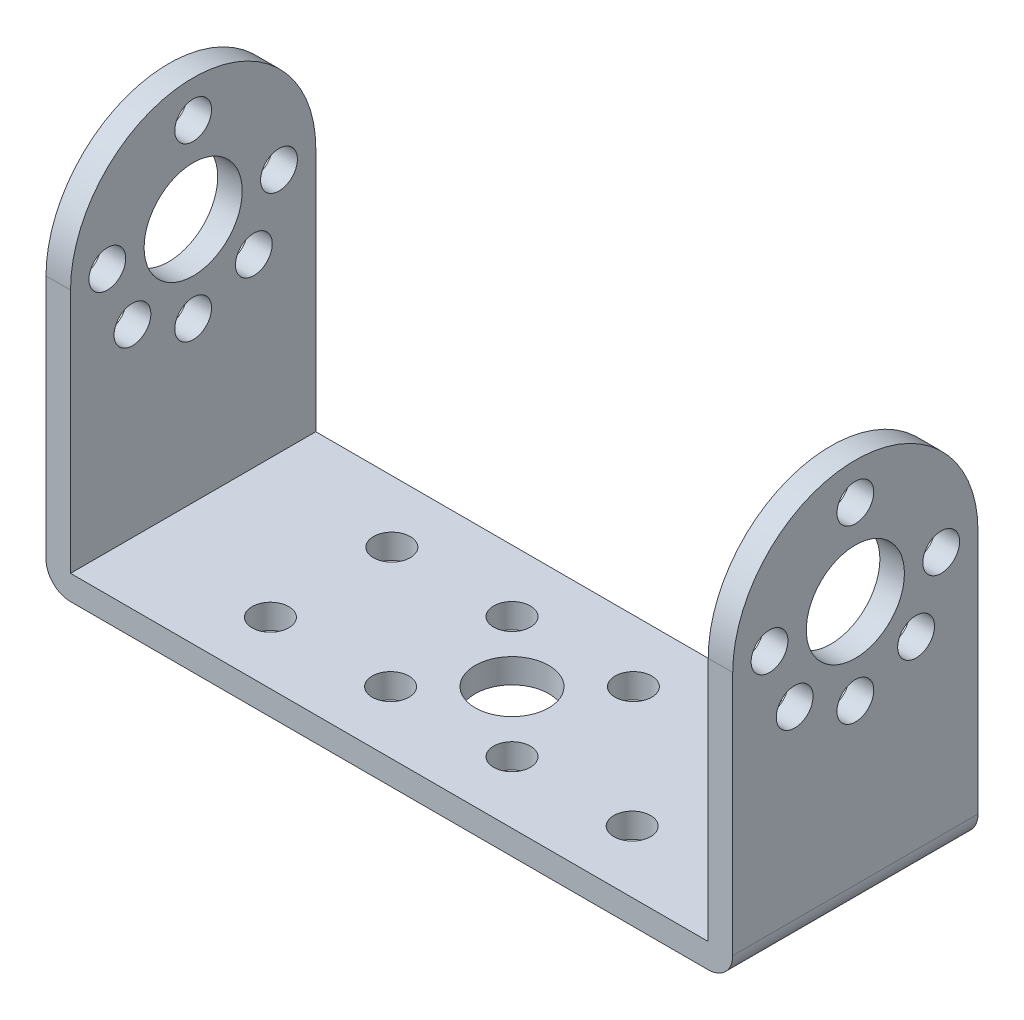
ISO-10303-21;
HEADER;
FILE_DESCRIPTION(('STEP AP214'),'2;1');
FILE_NAME('part.step','',(''),(''),'','','');
FILE_SCHEMA(('AUTOMOTIVE_DESIGN { 1 0 10303 214 1 1 1 1 }'));
ENDSEC;
DATA;
#1=APPLICATION_CONTEXT('core data for automotive mechanical design processes');
#2=APPLICATION_PROTOCOL_DEFINITION('international standard','automotive_design',2000,#1);
#3=PRODUCT_CONTEXT('',#1,'mechanical');
#4=PRODUCT('Part','Part','',(#3));
#5=PRODUCT_RELATED_PRODUCT_CATEGORY('part','',(#4));
#6=PRODUCT_DEFINITION_FORMATION('','',#4);
#7=PRODUCT_DEFINITION_CONTEXT('part definition',#1,'design');
#8=PRODUCT_DEFINITION('design','',#6,#7);
#9=PRODUCT_DEFINITION_SHAPE('','',#8);
#10=(LENGTH_UNIT() NAMED_UNIT(*) SI_UNIT(.MILLI.,.METRE.));
#11=(NAMED_UNIT(*) PLANE_ANGLE_UNIT() SI_UNIT($,.RADIAN.));
#12=(NAMED_UNIT(*) SI_UNIT($,.STERADIAN.) SOLID_ANGLE_UNIT());
#13=UNCERTAINTY_MEASURE_WITH_UNIT(LENGTH_MEASURE(1.E-05),#10,'distance_accuracy_value','');
#14=(GEOMETRIC_REPRESENTATION_CONTEXT(3) GLOBAL_UNCERTAINTY_ASSIGNED_CONTEXT((#13)) GLOBAL_UNIT_ASSIGNED_CONTEXT((#10,
#11,#12)) REPRESENTATION_CONTEXT('',''));
#15=CARTESIAN_POINT('',(0.,0.,0.));
#16=DIRECTION('',(0.,0.,1.));
#17=DIRECTION('',(1.,0.,0.));
#18=AXIS2_PLACEMENT_3D('',#15,#16,#17);
#19=CARTESIAN_POINT('',(26.,32.,-9.99999999999999));
#20=DIRECTION('',(1.,0.,0.));
#21=DIRECTION('',(0.,0.,-1.));
#22=AXIS2_PLACEMENT_3D('',#19,#20,#21);
#23=PLANE('',#22);
#24=CARTESIAN_POINT('',(26.,17.0502525316941,-4.94974746830577));
#25=DIRECTION('',(1.,0.,0.));
#26=DIRECTION('',(0.,0.,-1.));
#27=AXIS2_PLACEMENT_3D('',#24,#25,#26);
#28=CIRCLE('',#27,1.5);
#29=CARTESIAN_POINT('',(26.,17.0502525316941,-6.44974746830577));
#30=VERTEX_POINT('',#29);
#31=EDGE_CURVE('E422',#30,#30,#28,.T.);
#32=ORIENTED_EDGE('',*,*,#31,.T.);
#33=EDGE_LOOP('',(#32));
#34=FACE_BOUND('',#33,.T.);
#35=CARTESIAN_POINT('',(26.,17.0502525316942,4.94974746830584));
#36=DIRECTION('',(1.,0.,0.));
#37=DIRECTION('',(0.,0.,-1.));
#38=AXIS2_PLACEMENT_3D('',#35,#36,#37);
#39=CIRCLE('',#38,1.5);
#40=CARTESIAN_POINT('',(26.,17.0502525316942,3.44974746830584));
#41=VERTEX_POINT('',#40);
#42=EDGE_CURVE('E465',#41,#41,#39,.T.);
#43=ORIENTED_EDGE('',*,*,#42,.T.);
#44=EDGE_LOOP('',(#43));
#45=FACE_BOUND('',#44,.T.);
#46=CARTESIAN_POINT('',(26.,21.9999999999999,-7.));
#47=DIRECTION('',(1.,0.,0.));
#48=DIRECTION('',(0.,0.,-1.));
#49=AXIS2_PLACEMENT_3D('',#46,#47,#48);
#50=CIRCLE('',#49,1.5);
#51=CARTESIAN_POINT('',(26.,21.9999999999999,-8.5));
#52=VERTEX_POINT('',#51);
#53=EDGE_CURVE('E459',#52,#52,#50,.T.);
#54=ORIENTED_EDGE('',*,*,#53,.T.);
#55=EDGE_LOOP('',(#54));
#56=FACE_BOUND('',#55,.T.);
#57=CARTESIAN_POINT('',(26.,22.,7.));
#58=DIRECTION('',(1.,0.,0.));
#59=DIRECTION('',(0.,0.,-1.));
#60=AXIS2_PLACEMENT_3D('',#57,#58,#59);
#61=CIRCLE('',#60,1.5);
#62=CARTESIAN_POINT('',(26.,22.,5.5));
#63=VERTEX_POINT('',#62);
#64=EDGE_CURVE('E453',#63,#63,#61,.T.);
#65=ORIENTED_EDGE('',*,*,#64,.T.);
#66=EDGE_LOOP('',(#65));
#67=FACE_BOUND('',#66,.T.);
#68=CARTESIAN_POINT('',(26.,22.,0.));
#69=DIRECTION('',(1.,0.,0.));
#70=DIRECTION('',(0.,0.,-1.));
#71=AXIS2_PLACEMENT_3D('',#68,#69,#70);
#72=CIRCLE('',#71,4.);
#73=CARTESIAN_POINT('',(26.,22.,-4.));
#74=VERTEX_POINT('',#73);
#75=EDGE_CURVE('E447',#74,#74,#72,.T.);
#76=ORIENTED_EDGE('',*,*,#75,.T.);
#77=EDGE_LOOP('',(#76));
#78=FACE_BOUND('',#77,.T.);
#79=CARTESIAN_POINT('',(26.,29.,0.));
#80=DIRECTION('',(1.,0.,0.));
#81=DIRECTION('',(0.,0.,-1.));
#82=AXIS2_PLACEMENT_3D('',#79,#80,#81);
#83=CIRCLE('',#82,1.5);
#84=CARTESIAN_POINT('',(26.,29.,-1.50000000000005));
#85=VERTEX_POINT('',#84);
#86=EDGE_CURVE('E435',#85,#85,#83,.T.);
#87=ORIENTED_EDGE('',*,*,#86,.T.);
#88=EDGE_LOOP('',(#87));
#89=FACE_BOUND('',#88,.T.);
#90=CARTESIAN_POINT('',(26.,15.,0.));
#91=DIRECTION('',(1.,0.,0.));
#92=DIRECTION('',(0.,0.,-1.));
#93=AXIS2_PLACEMENT_3D('',#90,#91,#92);
#94=CIRCLE('',#93,1.5);
#95=CARTESIAN_POINT('',(26.,15.,-1.5));
#96=VERTEX_POINT('',#95);
#97=EDGE_CURVE('E441',#96,#96,#94,.T.);
#98=ORIENTED_EDGE('',*,*,#97,.T.);
#99=EDGE_LOOP('',(#98));
#100=FACE_BOUND('',#99,.T.);
#101=DIRECTION('',(0.,-1.,0.));
#102=VECTOR('',#101,1.);
#103=CARTESIAN_POINT('',(26.,32.,9.99999999999999));
#104=LINE('',#103,#102);
#105=CARTESIAN_POINT('',(26.,22.,10.));
#106=VERTEX_POINT('',#105);
#107=CARTESIAN_POINT('',(26.,2.,9.99999999999999));
#108=VERTEX_POINT('',#107);
#109=EDGE_CURVE('E325',#106,#108,#104,.T.);
#110=ORIENTED_EDGE('',*,*,#109,.F.);
#111=CARTESIAN_POINT('',(26.,22.,0.));
#112=DIRECTION('',(1.,0.,0.));
#113=DIRECTION('',(0.,0.,-1.));
#114=AXIS2_PLACEMENT_3D('',#111,#112,#113);
#115=CIRCLE('',#114,10.);
#116=CARTESIAN_POINT('',(26.,22.,-10.));
#117=VERTEX_POINT('',#116);
#118=EDGE_CURVE('E312',#117,#106,#115,.T.);
#119=ORIENTED_EDGE('',*,*,#118,.F.);
#120=DIRECTION('',(0.,-1.,0.));
#121=VECTOR('',#120,1.);
#122=CARTESIAN_POINT('',(26.,32.,-9.99999999999999));
#123=LINE('',#122,#121);
#124=CARTESIAN_POINT('',(26.,2.,-9.99999999999999));
#125=VERTEX_POINT('',#124);
#126=EDGE_CURVE('E317',#117,#125,#123,.T.);
#127=ORIENTED_EDGE('',*,*,#126,.T.);
#128=DIRECTION('',(0.,0.,-1.));
#129=VECTOR('',#128,1.);
#130=CARTESIAN_POINT('',(26.,2.,-9.99999999999999));
#131=LINE('',#130,#129);
#132=EDGE_CURVE('E382',#108,#125,#131,.T.);
#133=ORIENTED_EDGE('',*,*,#132,.F.);
#134=EDGE_LOOP('',(#110,#119,#127,#133));
#135=FACE_BOUND('',#134,.T.);
#136=ADVANCED_FACE('F202',(#34,#45,#56,#67,#78,#89,#100,#135),#23,.F.);
#137=CARTESIAN_POINT('',(28.,32.,-9.99999999999999));
#138=DIRECTION('',(-1.,0.,0.));
#139=DIRECTION('',(0.,0.,1.));
#140=AXIS2_PLACEMENT_3D('',#137,#138,#139);
#141=PLANE('',#140);
#142=CARTESIAN_POINT('',(28.,17.0502525316941,-4.94974746830577));
#143=DIRECTION('',(1.,0.,0.));
#144=DIRECTION('',(0.,0.,-1.));
#145=AXIS2_PLACEMENT_3D('',#142,#143,#144);
#146=CIRCLE('',#145,1.5);
#147=CARTESIAN_POINT('',(28.,17.0502525316941,-6.44974746830577));
#148=VERTEX_POINT('',#147);
#149=EDGE_CURVE('E660',#148,#148,#146,.T.);
#150=ORIENTED_EDGE('',*,*,#149,.F.);
#151=EDGE_LOOP('',(#150));
#152=FACE_BOUND('',#151,.T.);
#153=CARTESIAN_POINT('',(28.,17.0502525316942,4.94974746830584));
#154=DIRECTION('',(1.,0.,0.));
#155=DIRECTION('',(0.,0.,-1.));
#156=AXIS2_PLACEMENT_3D('',#153,#154,#155);
#157=CIRCLE('',#156,1.5);
#158=CARTESIAN_POINT('',(28.,17.0502525316942,3.44974746830584));
#159=VERTEX_POINT('',#158);
#160=EDGE_CURVE('E654',#159,#159,#157,.T.);
#161=ORIENTED_EDGE('',*,*,#160,.F.);
#162=EDGE_LOOP('',(#161));
#163=FACE_BOUND('',#162,.T.);
#164=CARTESIAN_POINT('',(28.,21.9999999999999,-7.));
#165=DIRECTION('',(1.,0.,0.));
#166=DIRECTION('',(0.,0.,-1.));
#167=AXIS2_PLACEMENT_3D('',#164,#165,#166);
#168=CIRCLE('',#167,1.5);
#169=CARTESIAN_POINT('',(28.,21.9999999999999,-8.5));
#170=VERTEX_POINT('',#169);
#171=EDGE_CURVE('E648',#170,#170,#168,.T.);
#172=ORIENTED_EDGE('',*,*,#171,.F.);
#173=EDGE_LOOP('',(#172));
#174=FACE_BOUND('',#173,.T.);
#175=CARTESIAN_POINT('',(28.,22.,7.));
#176=DIRECTION('',(1.,0.,0.));
#177=DIRECTION('',(0.,0.,-1.));
#178=AXIS2_PLACEMENT_3D('',#175,#176,#177);
#179=CIRCLE('',#178,1.5);
#180=CARTESIAN_POINT('',(28.,22.,5.5));
#181=VERTEX_POINT('',#180);
#182=EDGE_CURVE('E633',#181,#181,#179,.T.);
#183=ORIENTED_EDGE('',*,*,#182,.F.);
#184=EDGE_LOOP('',(#183));
#185=FACE_BOUND('',#184,.T.);
#186=CARTESIAN_POINT('',(28.,22.,0.));
#187=DIRECTION('',(1.,0.,0.));
#188=DIRECTION('',(0.,0.,-1.));
#189=AXIS2_PLACEMENT_3D('',#186,#187,#188);
#190=CIRCLE('',#189,4.);
#191=CARTESIAN_POINT('',(28.,22.,-4.));
#192=VERTEX_POINT('',#191);
#193=EDGE_CURVE('E427',#192,#192,#190,.T.);
#194=ORIENTED_EDGE('',*,*,#193,.F.);
#195=EDGE_LOOP('',(#194));
#196=FACE_BOUND('',#195,.T.);
#197=CARTESIAN_POINT('',(28.,29.,0.));
#198=DIRECTION('',(1.,0.,0.));
#199=DIRECTION('',(0.,0.,-1.));
#200=AXIS2_PLACEMENT_3D('',#197,#198,#199);
#201=CIRCLE('',#200,1.5);
#202=CARTESIAN_POINT('',(28.,29.,-1.50000000000005));
#203=VERTEX_POINT('',#202);
#204=EDGE_CURVE('E626',#203,#203,#201,.T.);
#205=ORIENTED_EDGE('',*,*,#204,.F.);
#206=EDGE_LOOP('',(#205));
#207=FACE_BOUND('',#206,.T.);
#208=CARTESIAN_POINT('',(28.,15.,0.));
#209=DIRECTION('',(1.,0.,0.));
#210=DIRECTION('',(0.,0.,-1.));
#211=AXIS2_PLACEMENT_3D('',#208,#209,#210);
#212=CIRCLE('',#211,1.5);
#213=CARTESIAN_POINT('',(28.,15.,-1.5));
#214=VERTEX_POINT('',#213);
#215=EDGE_CURVE('E618',#214,#214,#212,.T.);
#216=ORIENTED_EDGE('',*,*,#215,.F.);
#217=EDGE_LOOP('',(#216));
#218=FACE_BOUND('',#217,.T.);
#219=DIRECTION('',(0.,-1.,0.));
#220=VECTOR('',#219,1.);
#221=CARTESIAN_POINT('',(28.,32.,9.99999999999999));
#222=LINE('',#221,#220);
#223=CARTESIAN_POINT('',(28.,22.,10.));
#224=VERTEX_POINT('',#223);
#225=CARTESIAN_POINT('',(28.,2.,9.99999999999999));
#226=VERTEX_POINT('',#225);
#227=EDGE_CURVE('E322',#224,#226,#222,.T.);
#228=ORIENTED_EDGE('',*,*,#227,.T.);
#229=DIRECTION('',(0.,0.,-1.));
#230=VECTOR('',#229,1.);
#231=CARTESIAN_POINT('',(28.,2.,-9.99999999999999));
#232=LINE('',#231,#230);
#233=CARTESIAN_POINT('',(28.,2.,-9.99999999999999));
#234=VERTEX_POINT('',#233);
#235=EDGE_CURVE('E12',#226,#234,#232,.T.);
#236=ORIENTED_EDGE('',*,*,#235,.T.);
#237=DIRECTION('',(0.,-1.,0.));
#238=VECTOR('',#237,1.);
#239=CARTESIAN_POINT('',(28.,32.,-9.99999999999999));
#240=LINE('',#239,#238);
#241=CARTESIAN_POINT('',(28.,22.,-10.));
#242=VERTEX_POINT('',#241);
#243=EDGE_CURVE('E319',#242,#234,#240,.T.);
#244=ORIENTED_EDGE('',*,*,#243,.F.);
#245=CARTESIAN_POINT('',(28.,22.,0.));
#246=DIRECTION('',(1.,0.,0.));
#247=DIRECTION('',(0.,0.,-1.));
#248=AXIS2_PLACEMENT_3D('',#245,#246,#247);
#249=CIRCLE('',#248,10.);
#250=EDGE_CURVE('E293',#242,#224,#249,.T.);
#251=ORIENTED_EDGE('',*,*,#250,.T.);
#252=EDGE_LOOP('',(#228,#236,#244,#251));
#253=FACE_BOUND('',#252,.T.);
#254=ADVANCED_FACE('F417',(#152,#163,#174,#185,#196,#207,#218,#253),#141,.F.);
#255=CARTESIAN_POINT('',(-26.,32.,-9.99999999999997));
#256=DIRECTION('',(-1.,0.,0.));
#257=DIRECTION('',(0.,0.,1.));
#258=AXIS2_PLACEMENT_3D('',#255,#256,#257);
#259=PLANE('',#258);
#260=CARTESIAN_POINT('',(-26.,17.0502525316941,-4.94974746830577));
#261=DIRECTION('',(-1.,0.,0.));
#262=DIRECTION('',(0.,0.,1.));
#263=AXIS2_PLACEMENT_3D('',#260,#261,#262);
#264=CIRCLE('',#263,1.5);
#265=CARTESIAN_POINT('',(-26.,17.0502525316941,-3.44974746830577));
#266=VERTEX_POINT('',#265);
#267=EDGE_CURVE('E468',#266,#266,#264,.T.);
#268=ORIENTED_EDGE('',*,*,#267,.T.);
#269=EDGE_LOOP('',(#268));
#270=FACE_BOUND('',#269,.T.);
#271=CARTESIAN_POINT('',(-26.,17.0502525316942,4.94974746830584));
#272=DIRECTION('',(-1.,0.,0.));
#273=DIRECTION('',(0.,0.,1.));
#274=AXIS2_PLACEMENT_3D('',#271,#272,#273);
#275=CIRCLE('',#274,1.5);
#276=CARTESIAN_POINT('',(-26.,17.0502525316942,6.44974746830584));
#277=VERTEX_POINT('',#276);
#278=EDGE_CURVE('E462',#277,#277,#275,.T.);
#279=ORIENTED_EDGE('',*,*,#278,.T.);
#280=EDGE_LOOP('',(#279));
#281=FACE_BOUND('',#280,.T.);
#282=CARTESIAN_POINT('',(-26.,21.9999999999999,-7.));
#283=DIRECTION('',(-1.,0.,0.));
#284=DIRECTION('',(0.,0.,1.));
#285=AXIS2_PLACEMENT_3D('',#282,#283,#284);
#286=CIRCLE('',#285,1.5);
#287=CARTESIAN_POINT('',(-26.,21.9999999999999,-5.5));
#288=VERTEX_POINT('',#287);
#289=EDGE_CURVE('E456',#288,#288,#286,.T.);
#290=ORIENTED_EDGE('',*,*,#289,.T.);
#291=EDGE_LOOP('',(#290));
#292=FACE_BOUND('',#291,.T.);
#293=CARTESIAN_POINT('',(-26.,22.,7.));
#294=DIRECTION('',(-1.,0.,0.));
#295=DIRECTION('',(0.,0.,1.));
#296=AXIS2_PLACEMENT_3D('',#293,#294,#295);
#297=CIRCLE('',#296,1.5);
#298=CARTESIAN_POINT('',(-26.,22.,8.5));
#299=VERTEX_POINT('',#298);
#300=EDGE_CURVE('E450',#299,#299,#297,.T.);
#301=ORIENTED_EDGE('',*,*,#300,.T.);
#302=EDGE_LOOP('',(#301));
#303=FACE_BOUND('',#302,.T.);
#304=CARTESIAN_POINT('',(-26.,22.,0.));
#305=DIRECTION('',(-1.,0.,0.));
#306=DIRECTION('',(0.,0.,1.));
#307=AXIS2_PLACEMENT_3D('',#304,#305,#306);
#308=CIRCLE('',#307,4.);
#309=CARTESIAN_POINT('',(-26.,22.,4.));
#310=VERTEX_POINT('',#309);
#311=EDGE_CURVE('E444',#310,#310,#308,.T.);
#312=ORIENTED_EDGE('',*,*,#311,.T.);
#313=EDGE_LOOP('',(#312));
#314=FACE_BOUND('',#313,.T.);
#315=CARTESIAN_POINT('',(-26.,29.,0.));
#316=DIRECTION('',(-1.,0.,0.));
#317=DIRECTION('',(0.,0.,1.));
#318=AXIS2_PLACEMENT_3D('',#315,#316,#317);
#319=CIRCLE('',#318,1.5);
#320=CARTESIAN_POINT('',(-26.,29.,1.49999999999995));
#321=VERTEX_POINT('',#320);
#322=EDGE_CURVE('E301',#321,#321,#319,.T.);
#323=ORIENTED_EDGE('',*,*,#322,.T.);
#324=EDGE_LOOP('',(#323));
#325=FACE_BOUND('',#324,.T.);
#326=CARTESIAN_POINT('',(-26.,15.,0.));
#327=DIRECTION('',(-1.,0.,0.));
#328=DIRECTION('',(0.,0.,1.));
#329=AXIS2_PLACEMENT_3D('',#326,#327,#328);
#330=CIRCLE('',#329,1.5);
#331=CARTESIAN_POINT('',(-26.,15.,1.5));
#332=VERTEX_POINT('',#331);
#333=EDGE_CURVE('E438',#332,#332,#330,.T.);
#334=ORIENTED_EDGE('',*,*,#333,.T.);
#335=EDGE_LOOP('',(#334));
#336=FACE_BOUND('',#335,.T.);
#337=CARTESIAN_POINT('',(-26.,22.,0.));
#338=DIRECTION('',(-1.,0.,0.));
#339=DIRECTION('',(0.,0.,1.));
#340=AXIS2_PLACEMENT_3D('',#337,#338,#339);
#341=CIRCLE('',#340,10.);
#342=CARTESIAN_POINT('',(-26.,22.,10.));
#343=VERTEX_POINT('',#342);
#344=CARTESIAN_POINT('',(-26.,22.,-10.));
#345=VERTEX_POINT('',#344);
#346=EDGE_CURVE('E474',#343,#345,#341,.T.);
#347=ORIENTED_EDGE('',*,*,#346,.F.);
#348=DIRECTION('',(0.,-1.,0.));
#349=VECTOR('',#348,1.);
#350=CARTESIAN_POINT('',(-26.,32.,9.99999999999999));
#351=LINE('',#350,#349);
#352=CARTESIAN_POINT('',(-26.,2.,9.99999999999999));
#353=VERTEX_POINT('',#352);
#354=EDGE_CURVE('E300',#343,#353,#351,.T.);
#355=ORIENTED_EDGE('',*,*,#354,.T.);
#356=DIRECTION('',(0.,0.,1.));
#357=VECTOR('',#356,1.);
#358=CARTESIAN_POINT('',(-26.,2.,-9.99999999999997));
#359=LINE('',#358,#357);
#360=CARTESIAN_POINT('',(-26.,2.,-9.99999999999997));
#361=VERTEX_POINT('',#360);
#362=EDGE_CURVE('E389',#361,#353,#359,.T.);
#363=ORIENTED_EDGE('',*,*,#362,.F.);
#364=DIRECTION('',(0.,-1.,0.));
#365=VECTOR('',#364,1.);
#366=CARTESIAN_POINT('',(-26.,32.,-9.99999999999997));
#367=LINE('',#366,#365);
#368=EDGE_CURVE('E310',#345,#361,#367,.T.);
#369=ORIENTED_EDGE('',*,*,#368,.F.);
#370=EDGE_LOOP('',(#347,#355,#363,#369));
#371=FACE_BOUND('',#370,.T.);
#372=ADVANCED_FACE('F479',(#270,#281,#292,#303,#314,#325,#336,#371),#259,.F.);
#373=CARTESIAN_POINT('',(-28.,32.,-9.99999999999999));
#374=DIRECTION('',(1.,0.,0.));
#375=DIRECTION('',(0.,0.,-1.));
#376=AXIS2_PLACEMENT_3D('',#373,#374,#375);
#377=PLANE('',#376);
#378=CARTESIAN_POINT('',(-28.,17.0502525316941,-4.94974746830577));
#379=DIRECTION('',(1.,0.,0.));
#380=DIRECTION('',(0.,0.,-1.));
#381=AXIS2_PLACEMENT_3D('',#378,#379,#380);
#382=CIRCLE('',#381,1.5);
#383=CARTESIAN_POINT('',(-28.,17.0502525316941,-6.44974746830577));
#384=VERTEX_POINT('',#383);
#385=EDGE_CURVE('E577',#384,#384,#382,.T.);
#386=ORIENTED_EDGE('',*,*,#385,.T.);
#387=EDGE_LOOP('',(#386));
#388=FACE_BOUND('',#387,.T.);
#389=CARTESIAN_POINT('',(-28.,17.0502525316942,4.94974746830584));
#390=DIRECTION('',(1.,0.,0.));
#391=DIRECTION('',(0.,0.,-1.));
#392=AXIS2_PLACEMENT_3D('',#389,#390,#391);
#393=CIRCLE('',#392,1.5);
#394=CARTESIAN_POINT('',(-28.,17.0502525316942,3.44974746830584));
#395=VERTEX_POINT('',#394);
#396=EDGE_CURVE('E657',#395,#395,#393,.T.);
#397=ORIENTED_EDGE('',*,*,#396,.T.);
#398=EDGE_LOOP('',(#397));
#399=FACE_BOUND('',#398,.T.);
#400=CARTESIAN_POINT('',(-28.,21.9999999999999,-7.));
#401=DIRECTION('',(1.,0.,0.));
#402=DIRECTION('',(0.,0.,-1.));
#403=AXIS2_PLACEMENT_3D('',#400,#401,#402);
#404=CIRCLE('',#403,1.5);
#405=CARTESIAN_POINT('',(-28.,21.9999999999999,-8.5));
#406=VERTEX_POINT('',#405);
#407=EDGE_CURVE('E651',#406,#406,#404,.T.);
#408=ORIENTED_EDGE('',*,*,#407,.T.);
#409=EDGE_LOOP('',(#408));
#410=FACE_BOUND('',#409,.T.);
#411=CARTESIAN_POINT('',(-28.,22.,7.));
#412=DIRECTION('',(1.,0.,0.));
#413=DIRECTION('',(0.,0.,-1.));
#414=AXIS2_PLACEMENT_3D('',#411,#412,#413);
#415=CIRCLE('',#414,1.5);
#416=CARTESIAN_POINT('',(-28.,22.,5.5));
#417=VERTEX_POINT('',#416);
#418=EDGE_CURVE('E643',#417,#417,#415,.T.);
#419=ORIENTED_EDGE('',*,*,#418,.T.);
#420=EDGE_LOOP('',(#419));
#421=FACE_BOUND('',#420,.T.);
#422=CARTESIAN_POINT('',(-28.,22.,0.));
#423=DIRECTION('',(1.,0.,0.));
#424=DIRECTION('',(0.,0.,-1.));
#425=AXIS2_PLACEMENT_3D('',#422,#423,#424);
#426=CIRCLE('',#425,4.);
#427=CARTESIAN_POINT('',(-28.,22.,-4.));
#428=VERTEX_POINT('',#427);
#429=EDGE_CURVE('E429',#428,#428,#426,.T.);
#430=ORIENTED_EDGE('',*,*,#429,.T.);
#431=EDGE_LOOP('',(#430));
#432=FACE_BOUND('',#431,.T.);
#433=CARTESIAN_POINT('',(-28.,29.,0.));
#434=DIRECTION('',(1.,0.,0.));
#435=DIRECTION('',(0.,0.,-1.));
#436=AXIS2_PLACEMENT_3D('',#433,#434,#435);
#437=CIRCLE('',#436,1.5);
#438=CARTESIAN_POINT('',(-28.,29.,-1.50000000000005));
#439=VERTEX_POINT('',#438);
#440=EDGE_CURVE('E630',#439,#439,#437,.T.);
#441=ORIENTED_EDGE('',*,*,#440,.T.);
#442=EDGE_LOOP('',(#441));
#443=FACE_BOUND('',#442,.T.);
#444=CARTESIAN_POINT('',(-28.,15.,0.));
#445=DIRECTION('',(1.,0.,0.));
#446=DIRECTION('',(0.,0.,-1.));
#447=AXIS2_PLACEMENT_3D('',#444,#445,#446);
#448=CIRCLE('',#447,1.5);
#449=CARTESIAN_POINT('',(-28.,15.,-1.5));
#450=VERTEX_POINT('',#449);
#451=EDGE_CURVE('E622',#450,#450,#448,.T.);
#452=ORIENTED_EDGE('',*,*,#451,.T.);
#453=EDGE_LOOP('',(#452));
#454=FACE_BOUND('',#453,.T.);
#455=DIRECTION('',(0.,-1.,0.));
#456=VECTOR('',#455,1.);
#457=CARTESIAN_POINT('',(-28.,32.,-9.99999999999999));
#458=LINE('',#457,#456);
#459=CARTESIAN_POINT('',(-28.,22.,-10.));
#460=VERTEX_POINT('',#459);
#461=CARTESIAN_POINT('',(-28.,2.,-9.99999999999999));
#462=VERTEX_POINT('',#461);
#463=EDGE_CURVE('E308',#460,#462,#458,.T.);
#464=ORIENTED_EDGE('',*,*,#463,.T.);
#465=DIRECTION('',(0.,0.,1.));
#466=VECTOR('',#465,1.);
#467=CARTESIAN_POINT('',(-28.,2.,-9.99999999999999));
#468=LINE('',#467,#466);
#469=CARTESIAN_POINT('',(-28.,2.,9.99999999999999));
#470=VERTEX_POINT('',#469);
#471=EDGE_CURVE('E307',#462,#470,#468,.T.);
#472=ORIENTED_EDGE('',*,*,#471,.T.);
#473=DIRECTION('',(0.,-1.,0.));
#474=VECTOR('',#473,1.);
#475=CARTESIAN_POINT('',(-28.,32.,9.99999999999999));
#476=LINE('',#475,#474);
#477=CARTESIAN_POINT('',(-28.,22.,10.));
#478=VERTEX_POINT('',#477);
#479=EDGE_CURVE('E298',#478,#470,#476,.T.);
#480=ORIENTED_EDGE('',*,*,#479,.F.);
#481=CARTESIAN_POINT('',(-28.,22.,0.));
#482=DIRECTION('',(1.,0.,0.));
#483=DIRECTION('',(0.,0.,-1.));
#484=AXIS2_PLACEMENT_3D('',#481,#482,#483);
#485=CIRCLE('',#484,10.);
#486=EDGE_CURVE('E281',#460,#478,#485,.T.);
#487=ORIENTED_EDGE('',*,*,#486,.F.);
#488=EDGE_LOOP('',(#464,#472,#480,#487));
#489=FACE_BOUND('',#488,.T.);
#490=ADVANCED_FACE('F305',(#388,#399,#410,#421,#432,#443,#454,#489),#377,.F.);
#491=CARTESIAN_POINT('',(-26.,2.,9.99999999999999));
#492=DIRECTION('',(0.,0.,-1.));
#493=DIRECTION('',(-1.,0.,0.));
#494=AXIS2_PLACEMENT_3D('',#491,#492,#493);
#495=PLANE('',#494);
#496=ORIENTED_EDGE('',*,*,#479,.T.);
#497=CARTESIAN_POINT('',(-26.,2.,9.99999999999999));
#498=DIRECTION('',(0.,0.,-1.));
#499=DIRECTION('',(-1.,0.,0.));
#500=AXIS2_PLACEMENT_3D('',#497,#498,#499);
#501=CIRCLE('',#500,2.);
#502=CARTESIAN_POINT('',(-26.,0.,9.99999999999999));
#503=VERTEX_POINT('',#502);
#504=EDGE_CURVE('E401',#470,#503,#501,.F.);
#505=ORIENTED_EDGE('',*,*,#504,.T.);
#506=DIRECTION('',(1.,0.,0.));
#507=VECTOR('',#506,1.);
#508=CARTESIAN_POINT('',(-26.,0.,9.99999999999999));
#509=LINE('',#508,#507);
#510=CARTESIAN_POINT('',(26.,0.,10.));
#511=VERTEX_POINT('',#510);
#512=EDGE_CURVE('E386',#503,#511,#509,.T.);
#513=ORIENTED_EDGE('',*,*,#512,.T.);
#514=CARTESIAN_POINT('',(26.,2.,10.));
#515=DIRECTION('',(0.,0.,-1.));
#516=DIRECTION('',(-1.,0.,0.));
#517=AXIS2_PLACEMENT_3D('',#514,#515,#516);
#518=CIRCLE('',#517,2.);
#519=EDGE_CURVE('E399',#511,#226,#518,.F.);
#520=ORIENTED_EDGE('',*,*,#519,.T.);
#521=ORIENTED_EDGE('',*,*,#227,.F.);
#522=DIRECTION('',(1.,0.,0.));
#523=VECTOR('',#522,1.);
#524=CARTESIAN_POINT('',(-28.,22.,10.));
#525=LINE('',#524,#523);
#526=EDGE_CURVE('E302',#106,#224,#525,.T.);
#527=ORIENTED_EDGE('',*,*,#526,.F.);
#528=ORIENTED_EDGE('',*,*,#109,.T.);
#529=DIRECTION('',(1.,0.,0.));
#530=VECTOR('',#529,1.);
#531=CARTESIAN_POINT('',(-26.,2.,9.99999999999999));
#532=LINE('',#531,#530);
#533=EDGE_CURVE('E392',#353,#108,#532,.T.);
#534=ORIENTED_EDGE('',*,*,#533,.F.);
#535=ORIENTED_EDGE('',*,*,#354,.F.);
#536=EDGE_CURVE('E284',#478,#343,#525,.T.);
#537=ORIENTED_EDGE('',*,*,#536,.F.);
#538=EDGE_LOOP('',(#496,#505,#513,#520,#521,#527,#528,#534,#535,#537));
#539=FACE_BOUND('',#538,.T.);
#540=ADVANCED_FACE('F297',(#539),#495,.F.);
#541=CARTESIAN_POINT('',(0.,2.,0.));
#542=DIRECTION('',(0.,1.,0.));
#543=DIRECTION('',(0.,0.,1.));
#544=AXIS2_PLACEMENT_3D('',#541,#542,#543);
#545=PLANE('',#544);
#546=CARTESIAN_POINT('',(-14.75,2.,4.94974746830584));
#547=DIRECTION('',(0.,1.,0.));
#548=DIRECTION('',(0.,0.,-1.));
#549=AXIS2_PLACEMENT_3D('',#546,#547,#548);
#550=CIRCLE('',#549,1.5);
#551=CARTESIAN_POINT('',(-14.75,2.,3.44974746830584));
#552=VERTEX_POINT('',#551);
#553=EDGE_CURVE('E334',#552,#552,#550,.T.);
#554=ORIENTED_EDGE('',*,*,#553,.F.);
#555=EDGE_LOOP('',(#554));
#556=FACE_BOUND('',#555,.T.);
#557=CARTESIAN_POINT('',(4.94974746830664,2.,4.94974746830501));
#558=DIRECTION('',(0.,1.,0.));
#559=DIRECTION('',(0.,0.,1.));
#560=AXIS2_PLACEMENT_3D('',#557,#558,#559);
#561=CIRCLE('',#560,1.4999999999989);
#562=CARTESIAN_POINT('',(4.94974746830664,2.,6.4497474683039));
#563=VERTEX_POINT('',#562);
#564=EDGE_CURVE('E346',#563,#563,#561,.T.);
#565=ORIENTED_EDGE('',*,*,#564,.F.);
#566=EDGE_LOOP('',(#565));
#567=FACE_BOUND('',#566,.T.);
#568=CARTESIAN_POINT('',(-4.94974746830664,2.,-4.94974746830665));
#569=DIRECTION('',(0.,1.,0.));
#570=DIRECTION('',(0.,0.,1.));
#571=AXIS2_PLACEMENT_3D('',#568,#569,#570);
#572=CIRCLE('',#571,1.49999999999965);
#573=CARTESIAN_POINT('',(-4.94974746830664,2.,-3.449747468307));
#574=VERTEX_POINT('',#573);
#575=EDGE_CURVE('E358',#574,#574,#572,.T.);
#576=ORIENTED_EDGE('',*,*,#575,.F.);
#577=EDGE_LOOP('',(#576));
#578=FACE_BOUND('',#577,.T.);
#579=CARTESIAN_POINT('',(-4.94974746830583,2.,4.94974746830585));
#580=DIRECTION('',(0.,1.,0.));
#581=DIRECTION('',(0.,0.,1.));
#582=AXIS2_PLACEMENT_3D('',#579,#580,#581);
#583=CIRCLE('',#582,1.5);
#584=CARTESIAN_POINT('',(-4.94974746830583,2.,6.44974746830585));
#585=VERTEX_POINT('',#584);
#586=EDGE_CURVE('E370',#585,#585,#583,.T.);
#587=ORIENTED_EDGE('',*,*,#586,.F.);
#588=EDGE_LOOP('',(#587));
#589=FACE_BOUND('',#588,.T.);
#590=ORIENTED_EDGE('',*,*,#132,.T.);
#591=DIRECTION('',(-1.,0.,0.));
#592=VECTOR('',#591,1.);
#593=CARTESIAN_POINT('',(-26.,2.,-9.99999999999997));
#594=LINE('',#593,#592);
#595=EDGE_CURVE('E385',#125,#361,#594,.T.);
#596=ORIENTED_EDGE('',*,*,#595,.T.);
#597=ORIENTED_EDGE('',*,*,#362,.T.);
#598=ORIENTED_EDGE('',*,*,#533,.T.);
#599=EDGE_LOOP('',(#590,#596,#597,#598));
#600=FACE_BOUND('',#599,.T.);
#601=CARTESIAN_POINT('',(0.,2.,0.));
#602=DIRECTION('',(0.,1.,0.));
#603=DIRECTION('',(0.,0.,1.));
#604=AXIS2_PLACEMENT_3D('',#601,#602,#603);
#605=CIRCLE('',#604,3.);
#606=CARTESIAN_POINT('',(0.,2.,3.));
#607=VERTEX_POINT('',#606);
#608=EDGE_CURVE('E376',#607,#607,#605,.T.);
#609=ORIENTED_EDGE('',*,*,#608,.F.);
#610=EDGE_LOOP('',(#609));
#611=FACE_BOUND('',#610,.T.);
#612=CARTESIAN_POINT('',(14.75,2.,4.94974746830583));
#613=DIRECTION('',(0.,1.,0.));
#614=DIRECTION('',(0.,0.,1.));
#615=AXIS2_PLACEMENT_3D('',#612,#613,#614);
#616=CIRCLE('',#615,1.5);
#617=CARTESIAN_POINT('',(14.75,2.,6.44974746830583));
#618=VERTEX_POINT('',#617);
#619=EDGE_CURVE('E364',#618,#618,#616,.T.);
#620=ORIENTED_EDGE('',*,*,#619,.F.);
#621=EDGE_LOOP('',(#620));
#622=FACE_BOUND('',#621,.T.);
#623=CARTESIAN_POINT('',(4.94974746830584,2.,-4.94974746830748));
#624=DIRECTION('',(0.,1.,0.));
#625=DIRECTION('',(0.,0.,1.));
#626=AXIS2_PLACEMENT_3D('',#623,#624,#625);
#627=CIRCLE('',#626,1.49999999999855);
#628=CARTESIAN_POINT('',(4.94974746830584,2.,-3.44974746830893));
#629=VERTEX_POINT('',#628);
#630=EDGE_CURVE('E352',#629,#629,#627,.T.);
#631=ORIENTED_EDGE('',*,*,#630,.F.);
#632=EDGE_LOOP('',(#631));
#633=FACE_BOUND('',#632,.T.);
#634=CARTESIAN_POINT('',(14.75,2.,-4.94974746830665));
#635=DIRECTION('',(0.,1.,0.));
#636=DIRECTION('',(0.,0.,1.));
#637=AXIS2_PLACEMENT_3D('',#634,#635,#636);
#638=CIRCLE('',#637,1.49999999999976);
#639=CARTESIAN_POINT('',(14.75,2.,-3.44974746830689));
#640=VERTEX_POINT('',#639);
#641=EDGE_CURVE('E340',#640,#640,#638,.T.);
#642=ORIENTED_EDGE('',*,*,#641,.F.);
#643=EDGE_LOOP('',(#642));
#644=FACE_BOUND('',#643,.T.);
#645=CARTESIAN_POINT('',(-14.75,2.,-4.94974746830665));
#646=DIRECTION('',(0.,1.,0.));
#647=DIRECTION('',(0.,0.,-1.));
#648=AXIS2_PLACEMENT_3D('',#645,#646,#647);
#649=CIRCLE('',#648,1.49999999999978);
#650=CARTESIAN_POINT('',(-14.75,2.,-6.44974746830643));
#651=VERTEX_POINT('',#650);
#652=EDGE_CURVE('E328',#651,#651,#649,.T.);
#653=ORIENTED_EDGE('',*,*,#652,.F.);
#654=EDGE_LOOP('',(#653));
#655=FACE_BOUND('',#654,.T.);
#656=ADVANCED_FACE('F481',(#556,#567,#578,#589,#600,#611,#622,#633,#644,#655),#545,.T.);
#657=CARTESIAN_POINT('',(0.,0.,0.));
#658=DIRECTION('',(0.,1.,0.));
#659=DIRECTION('',(0.,0.,1.));
#660=AXIS2_PLACEMENT_3D('',#657,#658,#659);
#661=PLANE('',#660);
#662=ORIENTED_EDGE('',*,*,#512,.F.);
#663=DIRECTION('',(0.,0.,1.));
#664=VECTOR('',#663,1.);
#665=CARTESIAN_POINT('',(-26.,0.,0.));
#666=LINE('',#665,#664);
#667=CARTESIAN_POINT('',(-26.,0.,-9.99999999999997));
#668=VERTEX_POINT('',#667);
#669=EDGE_CURVE('E224',#503,#668,#666,.F.);
#670=ORIENTED_EDGE('',*,*,#669,.T.);
#671=DIRECTION('',(-1.,0.,0.));
#672=VECTOR('',#671,1.);
#673=CARTESIAN_POINT('',(-26.,0.,-9.99999999999997));
#674=LINE('',#673,#672);
#675=CARTESIAN_POINT('',(26.,0.,-9.99999999999999));
#676=VERTEX_POINT('',#675);
#677=EDGE_CURVE('E379',#676,#668,#674,.T.);
#678=ORIENTED_EDGE('',*,*,#677,.F.);
#679=DIRECTION('',(0.,0.,-1.));
#680=VECTOR('',#679,1.);
#681=CARTESIAN_POINT('',(26.,0.,0.));
#682=LINE('',#681,#680);
#683=EDGE_CURVE('E403',#676,#511,#682,.F.);
#684=ORIENTED_EDGE('',*,*,#683,.T.);
#685=EDGE_LOOP('',(#662,#670,#678,#684));
#686=FACE_BOUND('',#685,.T.);
#687=CARTESIAN_POINT('',(0.,0.,0.));
#688=DIRECTION('',(0.,1.,0.));
#689=DIRECTION('',(0.,0.,1.));
#690=AXIS2_PLACEMENT_3D('',#687,#688,#689);
#691=CIRCLE('',#690,3.);
#692=CARTESIAN_POINT('',(0.,0.,3.));
#693=VERTEX_POINT('',#692);
#694=EDGE_CURVE('E373',#693,#693,#691,.T.);
#695=ORIENTED_EDGE('',*,*,#694,.T.);
#696=EDGE_LOOP('',(#695));
#697=FACE_BOUND('',#696,.T.);
#698=CARTESIAN_POINT('',(-4.94974746830583,0.,4.94974746830585));
#699=DIRECTION('',(0.,1.,0.));
#700=DIRECTION('',(0.,0.,1.));
#701=AXIS2_PLACEMENT_3D('',#698,#699,#700);
#702=CIRCLE('',#701,1.5);
#703=CARTESIAN_POINT('',(-4.94974746830583,0.,6.44974746830585));
#704=VERTEX_POINT('',#703);
#705=EDGE_CURVE('E367',#704,#704,#702,.T.);
#706=ORIENTED_EDGE('',*,*,#705,.T.);
#707=EDGE_LOOP('',(#706));
#708=FACE_BOUND('',#707,.T.);
#709=CARTESIAN_POINT('',(14.75,0.,4.94974746830583));
#710=DIRECTION('',(0.,1.,0.));
#711=DIRECTION('',(0.,0.,1.));
#712=AXIS2_PLACEMENT_3D('',#709,#710,#711);
#713=CIRCLE('',#712,1.5);
#714=CARTESIAN_POINT('',(14.75,0.,6.44974746830583));
#715=VERTEX_POINT('',#714);
#716=EDGE_CURVE('E361',#715,#715,#713,.T.);
#717=ORIENTED_EDGE('',*,*,#716,.T.);
#718=EDGE_LOOP('',(#717));
#719=FACE_BOUND('',#718,.T.);
#720=CARTESIAN_POINT('',(-4.94974746830664,0.,-4.94974746830665));
#721=DIRECTION('',(0.,1.,0.));
#722=DIRECTION('',(0.,0.,1.));
#723=AXIS2_PLACEMENT_3D('',#720,#721,#722);
#724=CIRCLE('',#723,1.49999999999965);
#725=CARTESIAN_POINT('',(-4.94974746830664,0.,-3.449747468307));
#726=VERTEX_POINT('',#725);
#727=EDGE_CURVE('E355',#726,#726,#724,.T.);
#728=ORIENTED_EDGE('',*,*,#727,.T.);
#729=EDGE_LOOP('',(#728));
#730=FACE_BOUND('',#729,.T.);
#731=CARTESIAN_POINT('',(4.94974746830584,0.,-4.94974746830748));
#732=DIRECTION('',(0.,1.,0.));
#733=DIRECTION('',(0.,0.,1.));
#734=AXIS2_PLACEMENT_3D('',#731,#732,#733);
#735=CIRCLE('',#734,1.49999999999855);
#736=CARTESIAN_POINT('',(4.94974746830584,0.,-3.44974746830893));
#737=VERTEX_POINT('',#736);
#738=EDGE_CURVE('E349',#737,#737,#735,.T.);
#739=ORIENTED_EDGE('',*,*,#738,.T.);
#740=EDGE_LOOP('',(#739));
#741=FACE_BOUND('',#740,.T.);
#742=CARTESIAN_POINT('',(4.94974746830664,0.,4.94974746830501));
#743=DIRECTION('',(0.,1.,0.));
#744=DIRECTION('',(0.,0.,1.));
#745=AXIS2_PLACEMENT_3D('',#742,#743,#744);
#746=CIRCLE('',#745,1.4999999999989);
#747=CARTESIAN_POINT('',(4.94974746830664,0.,6.4497474683039));
#748=VERTEX_POINT('',#747);
#749=EDGE_CURVE('E343',#748,#748,#746,.T.);
#750=ORIENTED_EDGE('',*,*,#749,.T.);
#751=EDGE_LOOP('',(#750));
#752=FACE_BOUND('',#751,.T.);
#753=CARTESIAN_POINT('',(14.75,0.,-4.94974746830665));
#754=DIRECTION('',(0.,1.,0.));
#755=DIRECTION('',(0.,0.,1.));
#756=AXIS2_PLACEMENT_3D('',#753,#754,#755);
#757=CIRCLE('',#756,1.49999999999976);
#758=CARTESIAN_POINT('',(14.75,0.,-3.44974746830689));
#759=VERTEX_POINT('',#758);
#760=EDGE_CURVE('E337',#759,#759,#757,.T.);
#761=ORIENTED_EDGE('',*,*,#760,.T.);
#762=EDGE_LOOP('',(#761));
#763=FACE_BOUND('',#762,.T.);
#764=CARTESIAN_POINT('',(-14.75,0.,4.94974746830584));
#765=DIRECTION('',(0.,1.,0.));
#766=DIRECTION('',(0.,0.,-1.));
#767=AXIS2_PLACEMENT_3D('',#764,#765,#766);
#768=CIRCLE('',#767,1.5);
#769=CARTESIAN_POINT('',(-14.75,0.,3.44974746830584));
#770=VERTEX_POINT('',#769);
#771=EDGE_CURVE('E331',#770,#770,#768,.T.);
#772=ORIENTED_EDGE('',*,*,#771,.T.);
#773=EDGE_LOOP('',(#772));
#774=FACE_BOUND('',#773,.T.);
#775=CARTESIAN_POINT('',(-14.75,0.,-4.94974746830665));
#776=DIRECTION('',(0.,1.,0.));
#777=DIRECTION('',(0.,0.,-1.));
#778=AXIS2_PLACEMENT_3D('',#775,#776,#777);
#779=CIRCLE('',#778,1.49999999999978);
#780=CARTESIAN_POINT('',(-14.75,0.,-6.44974746830643));
#781=VERTEX_POINT('',#780);
#782=EDGE_CURVE('E327',#781,#781,#779,.T.);
#783=ORIENTED_EDGE('',*,*,#782,.T.);
#784=EDGE_LOOP('',(#783));
#785=FACE_BOUND('',#784,.T.);
#786=ADVANCED_FACE('F412',(#686,#697,#708,#719,#730,#741,#752,#763,#774,#785),#661,.F.);
#787=CARTESIAN_POINT('',(-26.,2.,-9.99999999999997));
#788=DIRECTION('',(0.,0.,1.));
#789=DIRECTION('',(1.,0.,0.));
#790=AXIS2_PLACEMENT_3D('',#787,#788,#789);
#791=PLANE('',#790);
#792=ORIENTED_EDGE('',*,*,#677,.T.);
#793=CARTESIAN_POINT('',(-26.,2.,-9.99999999999997));
#794=DIRECTION('',(0.,0.,1.));
#795=DIRECTION('',(1.,0.,0.));
#796=AXIS2_PLACEMENT_3D('',#793,#794,#795);
#797=CIRCLE('',#796,2.);
#798=EDGE_CURVE('E210',#668,#462,#797,.F.);
#799=ORIENTED_EDGE('',*,*,#798,.T.);
#800=ORIENTED_EDGE('',*,*,#463,.F.);
#801=DIRECTION('',(1.,0.,0.));
#802=VECTOR('',#801,1.);
#803=CARTESIAN_POINT('',(-28.,22.,-10.));
#804=LINE('',#803,#802);
#805=EDGE_CURVE('E287',#460,#345,#804,.T.);
#806=ORIENTED_EDGE('',*,*,#805,.T.);
#807=ORIENTED_EDGE('',*,*,#368,.T.);
#808=ORIENTED_EDGE('',*,*,#595,.F.);
#809=ORIENTED_EDGE('',*,*,#126,.F.);
#810=EDGE_CURVE('E292',#117,#242,#804,.T.);
#811=ORIENTED_EDGE('',*,*,#810,.T.);
#812=ORIENTED_EDGE('',*,*,#243,.T.);
#813=CARTESIAN_POINT('',(26.,2.,-9.99999999999999));
#814=DIRECTION('',(0.,0.,1.));
#815=DIRECTION('',(1.,0.,0.));
#816=AXIS2_PLACEMENT_3D('',#813,#814,#815);
#817=CIRCLE('',#816,2.);
#818=EDGE_CURVE('E217',#234,#676,#817,.F.);
#819=ORIENTED_EDGE('',*,*,#818,.T.);
#820=EDGE_LOOP('',(#792,#799,#800,#806,#807,#808,#809,#811,#812,#819));
#821=FACE_BOUND('',#820,.T.);
#822=ADVANCED_FACE('F408',(#821),#791,.F.);
#823=CARTESIAN_POINT('',(0.,2.,0.));
#824=DIRECTION('',(0.,-1.,0.));
#825=DIRECTION('',(0.,0.,-1.));
#826=AXIS2_PLACEMENT_3D('',#823,#824,#825);
#827=CYLINDRICAL_SURFACE('',#826,3.);
#828=ORIENTED_EDGE('',*,*,#608,.T.);
#829=EDGE_LOOP('',(#828));
#830=FACE_BOUND('',#829,.T.);
#831=ORIENTED_EDGE('',*,*,#694,.F.);
#832=EDGE_LOOP('',(#831));
#833=FACE_BOUND('',#832,.T.);
#834=ADVANCED_FACE('F528',(#830,#833),#827,.F.);
#835=CARTESIAN_POINT('',(-4.94974746830583,2.,4.94974746830585));
#836=DIRECTION('',(0.,-1.,0.));
#837=DIRECTION('',(0.,0.,-1.));
#838=AXIS2_PLACEMENT_3D('',#835,#836,#837);
#839=CYLINDRICAL_SURFACE('',#838,1.5);
#840=ORIENTED_EDGE('',*,*,#586,.T.);
#841=EDGE_LOOP('',(#840));
#842=FACE_BOUND('',#841,.T.);
#843=ORIENTED_EDGE('',*,*,#705,.F.);
#844=EDGE_LOOP('',(#843));
#845=FACE_BOUND('',#844,.T.);
#846=ADVANCED_FACE('F524',(#842,#845),#839,.F.);
#847=CARTESIAN_POINT('',(14.75,2.,4.94974746830583));
#848=DIRECTION('',(0.,-1.,0.));
#849=DIRECTION('',(0.,0.,-1.));
#850=AXIS2_PLACEMENT_3D('',#847,#848,#849);
#851=CYLINDRICAL_SURFACE('',#850,1.5);
#852=ORIENTED_EDGE('',*,*,#619,.T.);
#853=EDGE_LOOP('',(#852));
#854=FACE_BOUND('',#853,.T.);
#855=ORIENTED_EDGE('',*,*,#716,.F.);
#856=EDGE_LOOP('',(#855));
#857=FACE_BOUND('',#856,.T.);
#858=ADVANCED_FACE('F520',(#854,#857),#851,.F.);
#859=CARTESIAN_POINT('',(-4.94974746830664,2.,-4.94974746830665));
#860=DIRECTION('',(0.,-1.,0.));
#861=DIRECTION('',(0.,0.,-1.));
#862=AXIS2_PLACEMENT_3D('',#859,#860,#861);
#863=CYLINDRICAL_SURFACE('',#862,1.49999999999965);
#864=ORIENTED_EDGE('',*,*,#575,.T.);
#865=EDGE_LOOP('',(#864));
#866=FACE_BOUND('',#865,.T.);
#867=ORIENTED_EDGE('',*,*,#727,.F.);
#868=EDGE_LOOP('',(#867));
#869=FACE_BOUND('',#868,.T.);
#870=ADVANCED_FACE('F516',(#866,#869),#863,.F.);
#871=CARTESIAN_POINT('',(4.94974746830584,2.,-4.94974746830748));
#872=DIRECTION('',(0.,-1.,0.));
#873=DIRECTION('',(0.,0.,-1.));
#874=AXIS2_PLACEMENT_3D('',#871,#872,#873);
#875=CYLINDRICAL_SURFACE('',#874,1.49999999999855);
#876=ORIENTED_EDGE('',*,*,#630,.T.);
#877=EDGE_LOOP('',(#876));
#878=FACE_BOUND('',#877,.T.);
#879=ORIENTED_EDGE('',*,*,#738,.F.);
#880=EDGE_LOOP('',(#879));
#881=FACE_BOUND('',#880,.T.);
#882=ADVANCED_FACE('F512',(#878,#881),#875,.F.);
#883=CARTESIAN_POINT('',(4.94974746830664,2.,4.94974746830501));
#884=DIRECTION('',(0.,-1.,0.));
#885=DIRECTION('',(0.,0.,-1.));
#886=AXIS2_PLACEMENT_3D('',#883,#884,#885);
#887=CYLINDRICAL_SURFACE('',#886,1.4999999999989);
#888=ORIENTED_EDGE('',*,*,#564,.T.);
#889=EDGE_LOOP('',(#888));
#890=FACE_BOUND('',#889,.T.);
#891=ORIENTED_EDGE('',*,*,#749,.F.);
#892=EDGE_LOOP('',(#891));
#893=FACE_BOUND('',#892,.T.);
#894=ADVANCED_FACE('F508',(#890,#893),#887,.F.);
#895=CARTESIAN_POINT('',(14.75,2.,-4.94974746830665));
#896=DIRECTION('',(0.,-1.,0.));
#897=DIRECTION('',(0.,0.,-1.));
#898=AXIS2_PLACEMENT_3D('',#895,#896,#897);
#899=CYLINDRICAL_SURFACE('',#898,1.49999999999976);
#900=ORIENTED_EDGE('',*,*,#641,.T.);
#901=EDGE_LOOP('',(#900));
#902=FACE_BOUND('',#901,.T.);
#903=ORIENTED_EDGE('',*,*,#760,.F.);
#904=EDGE_LOOP('',(#903));
#905=FACE_BOUND('',#904,.T.);
#906=ADVANCED_FACE('F504',(#902,#905),#899,.F.);
#907=CARTESIAN_POINT('',(-14.75,2.,4.94974746830584));
#908=DIRECTION('',(0.,-1.,0.));
#909=DIRECTION('',(0.,0.,-1.));
#910=AXIS2_PLACEMENT_3D('',#907,#908,#909);
#911=CYLINDRICAL_SURFACE('',#910,1.5);
#912=ORIENTED_EDGE('',*,*,#553,.T.);
#913=EDGE_LOOP('',(#912));
#914=FACE_BOUND('',#913,.T.);
#915=ORIENTED_EDGE('',*,*,#771,.F.);
#916=EDGE_LOOP('',(#915));
#917=FACE_BOUND('',#916,.T.);
#918=ADVANCED_FACE('F500',(#914,#917),#911,.F.);
#919=CARTESIAN_POINT('',(-14.75,2.,-4.94974746830665));
#920=DIRECTION('',(0.,-1.,0.));
#921=DIRECTION('',(0.,0.,-1.));
#922=AXIS2_PLACEMENT_3D('',#919,#920,#921);
#923=CYLINDRICAL_SURFACE('',#922,1.49999999999978);
#924=ORIENTED_EDGE('',*,*,#652,.T.);
#925=EDGE_LOOP('',(#924));
#926=FACE_BOUND('',#925,.T.);
#927=ORIENTED_EDGE('',*,*,#782,.F.);
#928=EDGE_LOOP('',(#927));
#929=FACE_BOUND('',#928,.T.);
#930=ADVANCED_FACE('F497',(#926,#929),#923,.F.);
#931=CARTESIAN_POINT('',(-28.,22.,0.));
#932=DIRECTION('',(1.,0.,0.));
#933=DIRECTION('',(0.,0.,-1.));
#934=AXIS2_PLACEMENT_3D('',#931,#932,#933);
#935=CYLINDRICAL_SURFACE('',#934,10.);
#936=ORIENTED_EDGE('',*,*,#346,.T.);
#937=ORIENTED_EDGE('',*,*,#805,.F.);
#938=ORIENTED_EDGE('',*,*,#486,.T.);
#939=ORIENTED_EDGE('',*,*,#536,.T.);
#940=EDGE_LOOP('',(#936,#937,#938,#939));
#941=FACE_BOUND('',#940,.T.);
#942=ADVANCED_FACE('F283',(#941),#935,.T.);
#943=ORIENTED_EDGE('',*,*,#118,.T.);
#944=ORIENTED_EDGE('',*,*,#526,.T.);
#945=ORIENTED_EDGE('',*,*,#250,.F.);
#946=ORIENTED_EDGE('',*,*,#810,.F.);
#947=EDGE_LOOP('',(#943,#944,#945,#946));
#948=FACE_BOUND('',#947,.T.);
#949=ADVANCED_FACE('F424',(#948),#935,.T.);
#950=CARTESIAN_POINT('',(-28.,29.,0.));
#951=DIRECTION('',(1.,0.,0.));
#952=DIRECTION('',(0.,0.,-1.));
#953=AXIS2_PLACEMENT_3D('',#950,#951,#952);
#954=CYLINDRICAL_SURFACE('',#953,1.5);
#955=ORIENTED_EDGE('',*,*,#440,.F.);
#956=EDGE_LOOP('',(#955));
#957=FACE_BOUND('',#956,.T.);
#958=ORIENTED_EDGE('',*,*,#322,.F.);
#959=EDGE_LOOP('',(#958));
#960=FACE_BOUND('',#959,.T.);
#961=ADVANCED_FACE('F571',(#957,#960),#954,.F.);
#962=CARTESIAN_POINT('',(-28.,15.,0.));
#963=DIRECTION('',(1.,0.,0.));
#964=DIRECTION('',(0.,0.,-1.));
#965=AXIS2_PLACEMENT_3D('',#962,#963,#964);
#966=CYLINDRICAL_SURFACE('',#965,1.5);
#967=ORIENTED_EDGE('',*,*,#451,.F.);
#968=EDGE_LOOP('',(#967));
#969=FACE_BOUND('',#968,.T.);
#970=ORIENTED_EDGE('',*,*,#333,.F.);
#971=EDGE_LOOP('',(#970));
#972=FACE_BOUND('',#971,.T.);
#973=ADVANCED_FACE('F594',(#969,#972),#966,.F.);
#974=CARTESIAN_POINT('',(-28.,22.,0.));
#975=DIRECTION('',(1.,0.,0.));
#976=DIRECTION('',(0.,0.,-1.));
#977=AXIS2_PLACEMENT_3D('',#974,#975,#976);
#978=CYLINDRICAL_SURFACE('',#977,4.);
#979=ORIENTED_EDGE('',*,*,#429,.F.);
#980=EDGE_LOOP('',(#979));
#981=FACE_BOUND('',#980,.T.);
#982=ORIENTED_EDGE('',*,*,#311,.F.);
#983=EDGE_LOOP('',(#982));
#984=FACE_BOUND('',#983,.T.);
#985=ADVANCED_FACE('F596',(#981,#984),#978,.F.);
#986=CARTESIAN_POINT('',(-28.,22.,7.));
#987=DIRECTION('',(1.,0.,0.));
#988=DIRECTION('',(0.,0.,-1.));
#989=AXIS2_PLACEMENT_3D('',#986,#987,#988);
#990=CYLINDRICAL_SURFACE('',#989,1.5);
#991=ORIENTED_EDGE('',*,*,#418,.F.);
#992=EDGE_LOOP('',(#991));
#993=FACE_BOUND('',#992,.T.);
#994=ORIENTED_EDGE('',*,*,#300,.F.);
#995=EDGE_LOOP('',(#994));
#996=FACE_BOUND('',#995,.T.);
#997=ADVANCED_FACE('F602',(#993,#996),#990,.F.);
#998=CARTESIAN_POINT('',(-28.,21.9999999999999,-7.));
#999=DIRECTION('',(1.,0.,0.));
#1000=DIRECTION('',(0.,0.,-1.));
#1001=AXIS2_PLACEMENT_3D('',#998,#999,#1000);
#1002=CYLINDRICAL_SURFACE('',#1001,1.5);
#1003=ORIENTED_EDGE('',*,*,#407,.F.);
#1004=EDGE_LOOP('',(#1003));
#1005=FACE_BOUND('',#1004,.T.);
#1006=ORIENTED_EDGE('',*,*,#289,.F.);
#1007=EDGE_LOOP('',(#1006));
#1008=FACE_BOUND('',#1007,.T.);
#1009=ADVANCED_FACE('F572',(#1005,#1008),#1002,.F.);
#1010=CARTESIAN_POINT('',(-28.,17.0502525316942,4.94974746830584));
#1011=DIRECTION('',(1.,0.,0.));
#1012=DIRECTION('',(0.,0.,-1.));
#1013=AXIS2_PLACEMENT_3D('',#1010,#1011,#1012);
#1014=CYLINDRICAL_SURFACE('',#1013,1.5);
#1015=ORIENTED_EDGE('',*,*,#396,.F.);
#1016=EDGE_LOOP('',(#1015));
#1017=FACE_BOUND('',#1016,.T.);
#1018=ORIENTED_EDGE('',*,*,#278,.F.);
#1019=EDGE_LOOP('',(#1018));
#1020=FACE_BOUND('',#1019,.T.);
#1021=ADVANCED_FACE('F557',(#1017,#1020),#1014,.F.);
#1022=CARTESIAN_POINT('',(-28.,17.0502525316941,-4.94974746830577));
#1023=DIRECTION('',(1.,0.,0.));
#1024=DIRECTION('',(0.,0.,-1.));
#1025=AXIS2_PLACEMENT_3D('',#1022,#1023,#1024);
#1026=CYLINDRICAL_SURFACE('',#1025,1.5);
#1027=ORIENTED_EDGE('',*,*,#385,.F.);
#1028=EDGE_LOOP('',(#1027));
#1029=FACE_BOUND('',#1028,.T.);
#1030=ORIENTED_EDGE('',*,*,#267,.F.);
#1031=EDGE_LOOP('',(#1030));
#1032=FACE_BOUND('',#1031,.T.);
#1033=ADVANCED_FACE('F550',(#1029,#1032),#1026,.F.);
#1034=ORIENTED_EDGE('',*,*,#204,.T.);
#1035=EDGE_LOOP('',(#1034));
#1036=FACE_BOUND('',#1035,.T.);
#1037=ORIENTED_EDGE('',*,*,#86,.F.);
#1038=EDGE_LOOP('',(#1037));
#1039=FACE_BOUND('',#1038,.T.);
#1040=ADVANCED_FACE('F562',(#1036,#1039),#954,.F.);
#1041=ORIENTED_EDGE('',*,*,#215,.T.);
#1042=EDGE_LOOP('',(#1041));
#1043=FACE_BOUND('',#1042,.T.);
#1044=ORIENTED_EDGE('',*,*,#97,.F.);
#1045=EDGE_LOOP('',(#1044));
#1046=FACE_BOUND('',#1045,.T.);
#1047=ADVANCED_FACE('F568',(#1043,#1046),#966,.F.);
#1048=ORIENTED_EDGE('',*,*,#193,.T.);
#1049=EDGE_LOOP('',(#1048));
#1050=FACE_BOUND('',#1049,.T.);
#1051=ORIENTED_EDGE('',*,*,#75,.F.);
#1052=EDGE_LOOP('',(#1051));
#1053=FACE_BOUND('',#1052,.T.);
#1054=ADVANCED_FACE('F605',(#1050,#1053),#978,.F.);
#1055=ORIENTED_EDGE('',*,*,#182,.T.);
#1056=EDGE_LOOP('',(#1055));
#1057=FACE_BOUND('',#1056,.T.);
#1058=ORIENTED_EDGE('',*,*,#64,.F.);
#1059=EDGE_LOOP('',(#1058));
#1060=FACE_BOUND('',#1059,.T.);
#1061=ADVANCED_FACE('F613',(#1057,#1060),#990,.F.);
#1062=ORIENTED_EDGE('',*,*,#171,.T.);
#1063=EDGE_LOOP('',(#1062));
#1064=FACE_BOUND('',#1063,.T.);
#1065=ORIENTED_EDGE('',*,*,#53,.F.);
#1066=EDGE_LOOP('',(#1065));
#1067=FACE_BOUND('',#1066,.T.);
#1068=ADVANCED_FACE('F554',(#1064,#1067),#1002,.F.);
#1069=ORIENTED_EDGE('',*,*,#160,.T.);
#1070=EDGE_LOOP('',(#1069));
#1071=FACE_BOUND('',#1070,.T.);
#1072=ORIENTED_EDGE('',*,*,#42,.F.);
#1073=EDGE_LOOP('',(#1072));
#1074=FACE_BOUND('',#1073,.T.);
#1075=ADVANCED_FACE('F547',(#1071,#1074),#1014,.F.);
#1076=ORIENTED_EDGE('',*,*,#149,.T.);
#1077=EDGE_LOOP('',(#1076));
#1078=FACE_BOUND('',#1077,.T.);
#1079=ORIENTED_EDGE('',*,*,#31,.F.);
#1080=EDGE_LOOP('',(#1079));
#1081=FACE_BOUND('',#1080,.T.);
#1082=ADVANCED_FACE('F542',(#1078,#1081),#1026,.F.);
#1083=CARTESIAN_POINT('',(-26.,2.,-9.99999999999999));
#1084=DIRECTION('',(0.,0.,1.));
#1085=DIRECTION('',(1.,0.,0.));
#1086=AXIS2_PLACEMENT_3D('',#1083,#1084,#1085);
#1087=CYLINDRICAL_SURFACE('',#1086,2.);
#1088=ORIENTED_EDGE('',*,*,#798,.F.);
#1089=ORIENTED_EDGE('',*,*,#669,.F.);
#1090=ORIENTED_EDGE('',*,*,#504,.F.);
#1091=ORIENTED_EDGE('',*,*,#471,.F.);
#1092=EDGE_LOOP('',(#1088,#1089,#1090,#1091));
#1093=FACE_BOUND('',#1092,.T.);
#1094=ADVANCED_FACE('F410',(#1093),#1087,.T.);
#1095=CARTESIAN_POINT('',(26.,2.,-9.99999999999999));
#1096=DIRECTION('',(0.,0.,-1.));
#1097=DIRECTION('',(-1.,0.,0.));
#1098=AXIS2_PLACEMENT_3D('',#1095,#1096,#1097);
#1099=CYLINDRICAL_SURFACE('',#1098,2.);
#1100=ORIENTED_EDGE('',*,*,#519,.F.);
#1101=ORIENTED_EDGE('',*,*,#683,.F.);
#1102=ORIENTED_EDGE('',*,*,#818,.F.);
#1103=ORIENTED_EDGE('',*,*,#235,.F.);
#1104=EDGE_LOOP('',(#1100,#1101,#1102,#1103));
#1105=FACE_BOUND('',#1104,.T.);
#1106=ADVANCED_FACE('F204',(#1105),#1099,.T.);
#1107=CLOSED_SHELL('',(#136,#254,#372,#490,#540,#656,#786,#822,#834,#846,#858,#870,#882,#894,
#906,#918,#930,#942,#949,#961,#973,#985,#997,#1009,#1021,#1033,#1040,#1047,#1054,#1061,#1068,
#1075,#1082,#1094,#1106));
#1108=MANIFOLD_SOLID_BREP('B2',#1107);
#1109=ADVANCED_BREP_SHAPE_REPRESENTATION('',(#18,#1108),#14);
#1110=SHAPE_DEFINITION_REPRESENTATION(#9,#1109);
ENDSEC;
END-ISO-10303-21;
